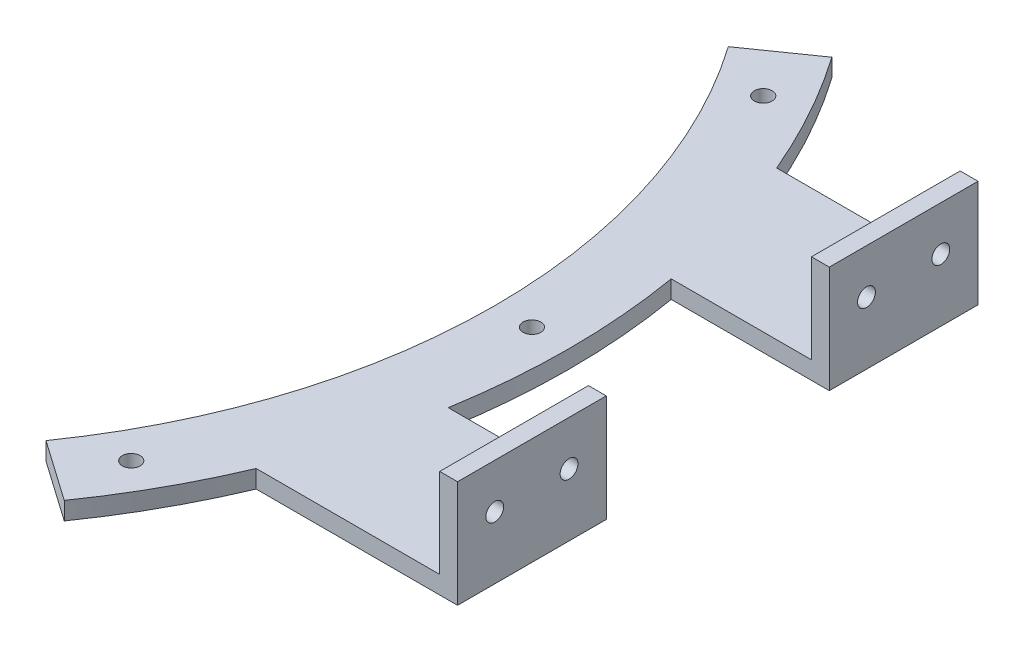
ISO-10303-21;
HEADER;
FILE_DESCRIPTION(('STEP AP214'),'2;1');
FILE_NAME('part.step','',(''),(''),'','','');
FILE_SCHEMA(('AUTOMOTIVE_DESIGN { 1 0 10303 214 1 1 1 1 }'));
ENDSEC;
DATA;
#1=APPLICATION_CONTEXT('core data for automotive mechanical design processes');
#2=APPLICATION_PROTOCOL_DEFINITION('international standard','automotive_design',2000,#1);
#3=PRODUCT_CONTEXT('',#1,'mechanical');
#4=PRODUCT('Part','Part','',(#3));
#5=PRODUCT_RELATED_PRODUCT_CATEGORY('part','',(#4));
#6=PRODUCT_DEFINITION_FORMATION('','',#4);
#7=PRODUCT_DEFINITION_CONTEXT('part definition',#1,'design');
#8=PRODUCT_DEFINITION('design','',#6,#7);
#9=PRODUCT_DEFINITION_SHAPE('','',#8);
#10=(LENGTH_UNIT() NAMED_UNIT(*) SI_UNIT(.MILLI.,.METRE.));
#11=(NAMED_UNIT(*) PLANE_ANGLE_UNIT() SI_UNIT($,.RADIAN.));
#12=(NAMED_UNIT(*) SI_UNIT($,.STERADIAN.) SOLID_ANGLE_UNIT());
#13=UNCERTAINTY_MEASURE_WITH_UNIT(LENGTH_MEASURE(1.E-05),#10,'distance_accuracy_value','');
#14=(GEOMETRIC_REPRESENTATION_CONTEXT(3) GLOBAL_UNCERTAINTY_ASSIGNED_CONTEXT((#13)) GLOBAL_UNIT_ASSIGNED_CONTEXT((#10,
#11,#12)) REPRESENTATION_CONTEXT('',''));
#15=CARTESIAN_POINT('',(0.,0.,0.));
#16=DIRECTION('',(0.,0.,1.));
#17=DIRECTION('',(1.,0.,0.));
#18=AXIS2_PLACEMENT_3D('',#15,#16,#17);
#19=CARTESIAN_POINT('',(0.,12.,0.));
#20=DIRECTION('',(0.,1.,0.));
#21=DIRECTION('',(0.,0.,1.));
#22=AXIS2_PLACEMENT_3D('',#19,#20,#21);
#23=PLANE('',#22);
#24=CARTESIAN_POINT('',(425.,12.,0.));
#25=DIRECTION('',(0.,1.,0.));
#26=DIRECTION('',(0.,0.,1.));
#27=AXIS2_PLACEMENT_3D('',#24,#25,#26);
#28=CIRCLE('',#27,5.99999999999999);
#29=CARTESIAN_POINT('',(425.,12.,5.99999999999999));
#30=VERTEX_POINT('',#29);
#31=EDGE_CURVE('E207',#30,#30,#28,.T.);
#32=ORIENTED_EDGE('',*,*,#31,.F.);
#33=EDGE_LOOP('',(#32));
#34=FACE_BOUND('',#33,.T.);
#35=CARTESIAN_POINT('',(368.060796608386,12.,212.5));
#36=DIRECTION('',(0.,1.,0.));
#37=DIRECTION('',(0.,0.,1.));
#38=AXIS2_PLACEMENT_3D('',#35,#36,#37);
#39=CIRCLE('',#38,5.99999999999999);
#40=CARTESIAN_POINT('',(368.060796608386,12.,218.5));
#41=VERTEX_POINT('',#40);
#42=EDGE_CURVE('E213',#41,#41,#39,.T.);
#43=ORIENTED_EDGE('',*,*,#42,.F.);
#44=EDGE_LOOP('',(#43));
#45=FACE_BOUND('',#44,.T.);
#46=CARTESIAN_POINT('',(368.060796608386,12.,-212.5));
#47=DIRECTION('',(0.,1.,0.));
#48=DIRECTION('',(0.,0.,1.));
#49=AXIS2_PLACEMENT_3D('',#46,#47,#48);
#50=CIRCLE('',#49,5.99999999999999);
#51=CARTESIAN_POINT('',(368.060796608386,12.,-206.5));
#52=VERTEX_POINT('',#51);
#53=EDGE_CURVE('E201',#52,#52,#50,.T.);
#54=ORIENTED_EDGE('',*,*,#53,.F.);
#55=EDGE_LOOP('',(#54));
#56=FACE_BOUND('',#55,.T.);
#57=DIRECTION('',(1.,0.,0.));
#58=VECTOR('',#57,1.);
#59=CARTESIAN_POINT('',(550.,12.,-74.9999999999999));
#60=LINE('',#59,#58);
#61=CARTESIAN_POINT('',(443.705983732471,12.,-74.9999999999999));
#62=VERTEX_POINT('',#61);
#63=CARTESIAN_POINT('',(538.,12.,-74.9999999999999));
#64=VERTEX_POINT('',#63);
#65=EDGE_CURVE('E50',#62,#64,#60,.T.);
#66=ORIENTED_EDGE('',*,*,#65,.T.);
#67=DIRECTION('',(0.,0.,1.));
#68=VECTOR('',#67,1.);
#69=CARTESIAN_POINT('',(538.,12.,-74.9999999999999));
#70=LINE('',#69,#68);
#71=CARTESIAN_POINT('',(538.,12.,-175.));
#72=VERTEX_POINT('',#71);
#73=EDGE_CURVE('E168',#72,#64,#70,.T.);
#74=ORIENTED_EDGE('',*,*,#73,.F.);
#75=DIRECTION('',(-1.,0.,0.));
#76=VECTOR('',#75,1.);
#77=CARTESIAN_POINT('',(550.,12.,-175.));
#78=LINE('',#77,#76);
#79=CARTESIAN_POINT('',(414.578098794425,12.,-175.));
#80=VERTEX_POINT('',#79);
#81=EDGE_CURVE('E219',#72,#80,#78,.T.);
#82=ORIENTED_EDGE('',*,*,#81,.T.);
#83=CARTESIAN_POINT('',(0.,12.,0.));
#84=DIRECTION('',(0.,1.,0.));
#85=DIRECTION('',(0.,0.,1.));
#86=AXIS2_PLACEMENT_3D('',#83,#84,#85);
#87=CIRCLE('',#86,450.);
#88=CARTESIAN_POINT('',(368.618419930047,12.,-258.10939635797));
#89=VERTEX_POINT('',#88);
#90=EDGE_CURVE('E222',#80,#89,#87,.T.);
#91=ORIENTED_EDGE('',*,*,#90,.T.);
#92=DIRECTION('',(-0.819152044288994,0.,0.573576436351044));
#93=VECTOR('',#92,1.);
#94=CARTESIAN_POINT('',(327.660817715597,12.,-229.430574540418));
#95=LINE('',#94,#93);
#96=CARTESIAN_POINT('',(327.660817715597,12.,-229.430574540418));
#97=VERTEX_POINT('',#96);
#98=EDGE_CURVE('E224',#89,#97,#95,.T.);
#99=ORIENTED_EDGE('',*,*,#98,.T.);
#100=CARTESIAN_POINT('',(0.,12.,0.));
#101=DIRECTION('',(0.,-1.,0.));
#102=DIRECTION('',(0.,0.,1.));
#103=AXIS2_PLACEMENT_3D('',#100,#101,#102);
#104=CIRCLE('',#103,400.);
#105=CARTESIAN_POINT('',(327.660817715597,12.,229.430574540418));
#106=VERTEX_POINT('',#105);
#107=EDGE_CURVE('E226',#97,#106,#104,.T.);
#108=ORIENTED_EDGE('',*,*,#107,.T.);
#109=DIRECTION('',(0.819152044288994,0.,0.573576436351044));
#110=VECTOR('',#109,1.);
#111=CARTESIAN_POINT('',(327.660817715597,12.,229.430574540418));
#112=LINE('',#111,#110);
#113=CARTESIAN_POINT('',(368.618419930047,12.,258.10939635797));
#114=VERTEX_POINT('',#113);
#115=EDGE_CURVE('E228',#106,#114,#112,.T.);
#116=ORIENTED_EDGE('',*,*,#115,.T.);
#117=CARTESIAN_POINT('',(0.,12.,0.));
#118=DIRECTION('',(0.,1.,0.));
#119=DIRECTION('',(0.,0.,1.));
#120=AXIS2_PLACEMENT_3D('',#117,#118,#119);
#121=CIRCLE('',#120,450.);
#122=CARTESIAN_POINT('',(414.578098794425,12.,175.));
#123=VERTEX_POINT('',#122);
#124=EDGE_CURVE('E230',#114,#123,#121,.T.);
#125=ORIENTED_EDGE('',*,*,#124,.T.);
#126=DIRECTION('',(1.,0.,0.));
#127=VECTOR('',#126,1.);
#128=CARTESIAN_POINT('',(550.,12.,175.));
#129=LINE('',#128,#127);
#130=CARTESIAN_POINT('',(538.,12.,175.));
#131=VERTEX_POINT('',#130);
#132=EDGE_CURVE('E232',#123,#131,#129,.T.);
#133=ORIENTED_EDGE('',*,*,#132,.T.);
#134=DIRECTION('',(0.,0.,1.));
#135=VECTOR('',#134,1.);
#136=CARTESIAN_POINT('',(538.,12.,175.));
#137=LINE('',#136,#135);
#138=CARTESIAN_POINT('',(538.,12.,75.));
#139=VERTEX_POINT('',#138);
#140=EDGE_CURVE('E57',#139,#131,#137,.T.);
#141=ORIENTED_EDGE('',*,*,#140,.F.);
#142=DIRECTION('',(-1.,0.,0.));
#143=VECTOR('',#142,1.);
#144=CARTESIAN_POINT('',(550.,12.,75.));
#145=LINE('',#144,#143);
#146=CARTESIAN_POINT('',(443.705983732471,12.,75.0000000000001));
#147=VERTEX_POINT('',#146);
#148=EDGE_CURVE('E234',#139,#147,#145,.T.);
#149=ORIENTED_EDGE('',*,*,#148,.T.);
#150=CARTESIAN_POINT('',(0.,12.,0.));
#151=DIRECTION('',(0.,1.,0.));
#152=DIRECTION('',(0.,0.,1.));
#153=AXIS2_PLACEMENT_3D('',#150,#151,#152);
#154=CIRCLE('',#153,450.);
#155=EDGE_CURVE('E236',#147,#62,#154,.T.);
#156=ORIENTED_EDGE('',*,*,#155,.T.);
#157=EDGE_LOOP('',(#66,#74,#82,#91,#99,#108,#116,#125,#133,#141,#149,#156));
#158=FACE_BOUND('',#157,.T.);
#159=ADVANCED_FACE('F35',(#34,#45,#56,#158),#23,.T.);
#160=CARTESIAN_POINT('',(0.,0.,0.));
#161=DIRECTION('',(0.,1.,0.));
#162=DIRECTION('',(0.,0.,1.));
#163=AXIS2_PLACEMENT_3D('',#160,#161,#162);
#164=PLANE('',#163);
#165=DIRECTION('',(1.,0.,0.));
#166=VECTOR('',#165,1.);
#167=CARTESIAN_POINT('',(550.,0.,-74.9999999999999));
#168=LINE('',#167,#166);
#169=CARTESIAN_POINT('',(443.705983732471,0.,-74.9999999999999));
#170=VERTEX_POINT('',#169);
#171=CARTESIAN_POINT('',(550.,0.,-74.9999999999999));
#172=VERTEX_POINT('',#171);
#173=EDGE_CURVE('E154',#170,#172,#168,.T.);
#174=ORIENTED_EDGE('',*,*,#173,.F.);
#175=CARTESIAN_POINT('',(0.,0.,0.));
#176=DIRECTION('',(0.,1.,0.));
#177=DIRECTION('',(0.,0.,1.));
#178=AXIS2_PLACEMENT_3D('',#175,#176,#177);
#179=CIRCLE('',#178,450.);
#180=CARTESIAN_POINT('',(443.705983732471,0.,75.0000000000001));
#181=VERTEX_POINT('',#180);
#182=EDGE_CURVE('E220',#181,#170,#179,.T.);
#183=ORIENTED_EDGE('',*,*,#182,.F.);
#184=DIRECTION('',(-1.,0.,0.));
#185=VECTOR('',#184,1.);
#186=CARTESIAN_POINT('',(550.,0.,75.));
#187=LINE('',#186,#185);
#188=CARTESIAN_POINT('',(550.,0.,75.));
#189=VERTEX_POINT('',#188);
#190=EDGE_CURVE('E258',#189,#181,#187,.T.);
#191=ORIENTED_EDGE('',*,*,#190,.F.);
#192=DIRECTION('',(0.,0.,-1.));
#193=VECTOR('',#192,1.);
#194=CARTESIAN_POINT('',(550.,0.,175.));
#195=LINE('',#194,#193);
#196=CARTESIAN_POINT('',(550.,0.,175.));
#197=VERTEX_POINT('',#196);
#198=EDGE_CURVE('E256',#197,#189,#195,.T.);
#199=ORIENTED_EDGE('',*,*,#198,.F.);
#200=DIRECTION('',(1.,0.,0.));
#201=VECTOR('',#200,1.);
#202=CARTESIAN_POINT('',(550.,0.,175.));
#203=LINE('',#202,#201);
#204=CARTESIAN_POINT('',(414.578098794425,0.,175.));
#205=VERTEX_POINT('',#204);
#206=EDGE_CURVE('E254',#205,#197,#203,.T.);
#207=ORIENTED_EDGE('',*,*,#206,.F.);
#208=CARTESIAN_POINT('',(0.,0.,0.));
#209=DIRECTION('',(0.,1.,0.));
#210=DIRECTION('',(0.,0.,1.));
#211=AXIS2_PLACEMENT_3D('',#208,#209,#210);
#212=CIRCLE('',#211,450.);
#213=CARTESIAN_POINT('',(368.618419930047,0.,258.10939635797));
#214=VERTEX_POINT('',#213);
#215=EDGE_CURVE('E252',#214,#205,#212,.T.);
#216=ORIENTED_EDGE('',*,*,#215,.F.);
#217=DIRECTION('',(0.819152044288994,0.,0.573576436351044));
#218=VECTOR('',#217,1.);
#219=CARTESIAN_POINT('',(327.660817715597,0.,229.430574540418));
#220=LINE('',#219,#218);
#221=CARTESIAN_POINT('',(327.660817715597,0.,229.430574540418));
#222=VERTEX_POINT('',#221);
#223=EDGE_CURVE('E250',#222,#214,#220,.T.);
#224=ORIENTED_EDGE('',*,*,#223,.F.);
#225=CARTESIAN_POINT('',(0.,0.,0.));
#226=DIRECTION('',(0.,-1.,0.));
#227=DIRECTION('',(0.,0.,1.));
#228=AXIS2_PLACEMENT_3D('',#225,#226,#227);
#229=CIRCLE('',#228,400.);
#230=CARTESIAN_POINT('',(327.660817715597,0.,-229.430574540418));
#231=VERTEX_POINT('',#230);
#232=EDGE_CURVE('E248',#231,#222,#229,.T.);
#233=ORIENTED_EDGE('',*,*,#232,.F.);
#234=DIRECTION('',(-0.819152044288994,0.,0.573576436351044));
#235=VECTOR('',#234,1.);
#236=CARTESIAN_POINT('',(327.660817715597,0.,-229.430574540418));
#237=LINE('',#236,#235);
#238=CARTESIAN_POINT('',(368.618419930047,0.,-258.10939635797));
#239=VERTEX_POINT('',#238);
#240=EDGE_CURVE('E246',#239,#231,#237,.T.);
#241=ORIENTED_EDGE('',*,*,#240,.F.);
#242=CARTESIAN_POINT('',(0.,0.,0.));
#243=DIRECTION('',(0.,1.,0.));
#244=DIRECTION('',(0.,0.,1.));
#245=AXIS2_PLACEMENT_3D('',#242,#243,#244);
#246=CIRCLE('',#245,450.);
#247=CARTESIAN_POINT('',(414.578098794425,0.,-175.));
#248=VERTEX_POINT('',#247);
#249=EDGE_CURVE('E244',#248,#239,#246,.T.);
#250=ORIENTED_EDGE('',*,*,#249,.F.);
#251=DIRECTION('',(-1.,0.,0.));
#252=VECTOR('',#251,1.);
#253=CARTESIAN_POINT('',(550.,0.,-175.));
#254=LINE('',#253,#252);
#255=CARTESIAN_POINT('',(550.,0.,-175.));
#256=VERTEX_POINT('',#255);
#257=EDGE_CURVE('E242',#256,#248,#254,.T.);
#258=ORIENTED_EDGE('',*,*,#257,.F.);
#259=DIRECTION('',(0.,0.,-1.));
#260=VECTOR('',#259,1.);
#261=CARTESIAN_POINT('',(550.,0.,-175.));
#262=LINE('',#261,#260);
#263=EDGE_CURVE('E240',#172,#256,#262,.T.);
#264=ORIENTED_EDGE('',*,*,#263,.F.);
#265=EDGE_LOOP('',(#174,#183,#191,#199,#207,#216,#224,#233,#241,#250,#258,#264));
#266=FACE_BOUND('',#265,.T.);
#267=CARTESIAN_POINT('',(368.060796608386,0.,212.5));
#268=DIRECTION('',(0.,1.,0.));
#269=DIRECTION('',(0.,0.,1.));
#270=AXIS2_PLACEMENT_3D('',#267,#268,#269);
#271=CIRCLE('',#270,5.99999999999999);
#272=CARTESIAN_POINT('',(368.060796608386,0.,218.5));
#273=VERTEX_POINT('',#272);
#274=EDGE_CURVE('E210',#273,#273,#271,.T.);
#275=ORIENTED_EDGE('',*,*,#274,.T.);
#276=EDGE_LOOP('',(#275));
#277=FACE_BOUND('',#276,.T.);
#278=CARTESIAN_POINT('',(425.,0.,0.));
#279=DIRECTION('',(0.,1.,0.));
#280=DIRECTION('',(0.,0.,1.));
#281=AXIS2_PLACEMENT_3D('',#278,#279,#280);
#282=CIRCLE('',#281,5.99999999999999);
#283=CARTESIAN_POINT('',(425.,0.,5.99999999999999));
#284=VERTEX_POINT('',#283);
#285=EDGE_CURVE('E204',#284,#284,#282,.T.);
#286=ORIENTED_EDGE('',*,*,#285,.T.);
#287=EDGE_LOOP('',(#286));
#288=FACE_BOUND('',#287,.T.);
#289=CARTESIAN_POINT('',(368.060796608386,0.,-212.5));
#290=DIRECTION('',(0.,1.,0.));
#291=DIRECTION('',(0.,0.,1.));
#292=AXIS2_PLACEMENT_3D('',#289,#290,#291);
#293=CIRCLE('',#292,5.99999999999999);
#294=CARTESIAN_POINT('',(368.060796608386,0.,-206.5));
#295=VERTEX_POINT('',#294);
#296=EDGE_CURVE('E200',#295,#295,#293,.T.);
#297=ORIENTED_EDGE('',*,*,#296,.T.);
#298=EDGE_LOOP('',(#297));
#299=FACE_BOUND('',#298,.T.);
#300=ADVANCED_FACE('F295',(#266,#277,#288,#299),#164,.F.);
#301=CARTESIAN_POINT('',(550.,12.,-74.9999999999999));
#302=DIRECTION('',(0.,0.,-1.));
#303=DIRECTION('',(-1.,0.,0.));
#304=AXIS2_PLACEMENT_3D('',#301,#302,#303);
#305=PLANE('',#304);
#306=ORIENTED_EDGE('',*,*,#173,.T.);
#307=DIRECTION('',(0.,-1.,0.));
#308=VECTOR('',#307,1.);
#309=CARTESIAN_POINT('',(550.,12.,-74.9999999999999));
#310=LINE('',#309,#308);
#311=CARTESIAN_POINT('',(550.,72.,-74.9999999999999));
#312=VERTEX_POINT('',#311);
#313=EDGE_CURVE('E11',#312,#172,#310,.T.);
#314=ORIENTED_EDGE('',*,*,#313,.F.);
#315=DIRECTION('',(1.,0.,0.));
#316=VECTOR('',#315,1.);
#317=CARTESIAN_POINT('',(550.,72.,-74.9999999999999));
#318=LINE('',#317,#316);
#319=CARTESIAN_POINT('',(538.,72.,-74.9999999999999));
#320=VERTEX_POINT('',#319);
#321=EDGE_CURVE('E151',#320,#312,#318,.T.);
#322=ORIENTED_EDGE('',*,*,#321,.F.);
#323=DIRECTION('',(0.,-1.,0.));
#324=VECTOR('',#323,1.);
#325=CARTESIAN_POINT('',(538.,72.,-74.9999999999999));
#326=LINE('',#325,#324);
#327=EDGE_CURVE('E177',#320,#64,#326,.T.);
#328=ORIENTED_EDGE('',*,*,#327,.T.);
#329=ORIENTED_EDGE('',*,*,#65,.F.);
#330=DIRECTION('',(0.,-1.,0.));
#331=VECTOR('',#330,1.);
#332=CARTESIAN_POINT('',(443.705983732471,12.,-74.9999999999999));
#333=LINE('',#332,#331);
#334=EDGE_CURVE('E238',#62,#170,#333,.T.);
#335=ORIENTED_EDGE('',*,*,#334,.T.);
#336=EDGE_LOOP('',(#306,#314,#322,#328,#329,#335));
#337=FACE_BOUND('',#336,.T.);
#338=ADVANCED_FACE('F37',(#337),#305,.F.);
#339=CARTESIAN_POINT('',(550.,12.,-175.));
#340=DIRECTION('',(-1.,0.,0.));
#341=DIRECTION('',(0.,0.,1.));
#342=AXIS2_PLACEMENT_3D('',#339,#340,#341);
#343=PLANE('',#342);
#344=CARTESIAN_POINT('',(550.,42.,-150.));
#345=DIRECTION('',(-1.,0.,0.));
#346=DIRECTION('',(0.,0.,1.));
#347=AXIS2_PLACEMENT_3D('',#344,#345,#346);
#348=CIRCLE('',#347,6.00000000000002);
#349=CARTESIAN_POINT('',(550.,42.,-144.));
#350=VERTEX_POINT('',#349);
#351=EDGE_CURVE('E170',#350,#350,#348,.T.);
#352=ORIENTED_EDGE('',*,*,#351,.T.);
#353=EDGE_LOOP('',(#352));
#354=FACE_BOUND('',#353,.T.);
#355=CARTESIAN_POINT('',(550.,42.,-99.9999999999999));
#356=DIRECTION('',(-1.,0.,0.));
#357=DIRECTION('',(0.,0.,1.));
#358=AXIS2_PLACEMENT_3D('',#355,#356,#357);
#359=CIRCLE('',#358,6.);
#360=CARTESIAN_POINT('',(550.,42.,-93.9999999999999));
#361=VERTEX_POINT('',#360);
#362=EDGE_CURVE('E407',#361,#361,#359,.T.);
#363=ORIENTED_EDGE('',*,*,#362,.T.);
#364=EDGE_LOOP('',(#363));
#365=FACE_BOUND('',#364,.T.);
#366=ORIENTED_EDGE('',*,*,#263,.T.);
#367=DIRECTION('',(0.,-1.,0.));
#368=VECTOR('',#367,1.);
#369=CARTESIAN_POINT('',(550.,12.,-175.));
#370=LINE('',#369,#368);
#371=CARTESIAN_POINT('',(550.,72.,-175.));
#372=VERTEX_POINT('',#371);
#373=EDGE_CURVE('E43',#372,#256,#370,.T.);
#374=ORIENTED_EDGE('',*,*,#373,.F.);
#375=DIRECTION('',(0.,0.,-1.));
#376=VECTOR('',#375,1.);
#377=CARTESIAN_POINT('',(550.,72.,-74.9999999999999));
#378=LINE('',#377,#376);
#379=EDGE_CURVE('E157',#312,#372,#378,.T.);
#380=ORIENTED_EDGE('',*,*,#379,.F.);
#381=ORIENTED_EDGE('',*,*,#313,.T.);
#382=EDGE_LOOP('',(#366,#374,#380,#381));
#383=FACE_BOUND('',#382,.T.);
#384=ADVANCED_FACE('F158',(#354,#365,#383),#343,.F.);
#385=CARTESIAN_POINT('',(550.,12.,-175.));
#386=DIRECTION('',(0.,0.,1.));
#387=DIRECTION('',(1.,0.,0.));
#388=AXIS2_PLACEMENT_3D('',#385,#386,#387);
#389=PLANE('',#388);
#390=ORIENTED_EDGE('',*,*,#257,.T.);
#391=DIRECTION('',(0.,-1.,0.));
#392=VECTOR('',#391,1.);
#393=CARTESIAN_POINT('',(414.578098794425,12.,-175.));
#394=LINE('',#393,#392);
#395=EDGE_CURVE('E286',#80,#248,#394,.T.);
#396=ORIENTED_EDGE('',*,*,#395,.F.);
#397=ORIENTED_EDGE('',*,*,#81,.F.);
#398=DIRECTION('',(0.,-1.,0.));
#399=VECTOR('',#398,1.);
#400=CARTESIAN_POINT('',(538.,72.,-175.));
#401=LINE('',#400,#399);
#402=CARTESIAN_POINT('',(538.,72.,-175.));
#403=VERTEX_POINT('',#402);
#404=EDGE_CURVE('E180',#403,#72,#401,.T.);
#405=ORIENTED_EDGE('',*,*,#404,.F.);
#406=DIRECTION('',(-1.,0.,0.));
#407=VECTOR('',#406,1.);
#408=CARTESIAN_POINT('',(550.,72.,-175.));
#409=LINE('',#408,#407);
#410=EDGE_CURVE('E162',#372,#403,#409,.T.);
#411=ORIENTED_EDGE('',*,*,#410,.F.);
#412=ORIENTED_EDGE('',*,*,#373,.T.);
#413=EDGE_LOOP('',(#390,#396,#397,#405,#411,#412));
#414=FACE_BOUND('',#413,.T.);
#415=ADVANCED_FACE('F290',(#414),#389,.F.);
#416=CARTESIAN_POINT('',(0.,12.,0.));
#417=DIRECTION('',(0.,-1.,0.));
#418=DIRECTION('',(0.,0.,-1.));
#419=AXIS2_PLACEMENT_3D('',#416,#417,#418);
#420=CYLINDRICAL_SURFACE('',#419,450.);
#421=ORIENTED_EDGE('',*,*,#249,.T.);
#422=DIRECTION('',(0.,-1.,0.));
#423=VECTOR('',#422,1.);
#424=CARTESIAN_POINT('',(368.618419930047,12.,-258.10939635797));
#425=LINE('',#424,#423);
#426=EDGE_CURVE('E283',#89,#239,#425,.T.);
#427=ORIENTED_EDGE('',*,*,#426,.F.);
#428=ORIENTED_EDGE('',*,*,#90,.F.);
#429=ORIENTED_EDGE('',*,*,#395,.T.);
#430=EDGE_LOOP('',(#421,#427,#428,#429));
#431=FACE_BOUND('',#430,.T.);
#432=ADVANCED_FACE('F301',(#431),#420,.T.);
#433=CARTESIAN_POINT('',(327.660817715597,12.,-229.430574540418));
#434=DIRECTION('',(0.573576436351044,0.,0.819152044288993));
#435=DIRECTION('',(0.819152044288994,0.,-0.573576436351044));
#436=AXIS2_PLACEMENT_3D('',#433,#434,#435);
#437=PLANE('',#436);
#438=ORIENTED_EDGE('',*,*,#240,.T.);
#439=DIRECTION('',(0.,-1.,0.));
#440=VECTOR('',#439,1.);
#441=CARTESIAN_POINT('',(327.660817715597,12.,-229.430574540418));
#442=LINE('',#441,#440);
#443=EDGE_CURVE('E280',#97,#231,#442,.T.);
#444=ORIENTED_EDGE('',*,*,#443,.F.);
#445=ORIENTED_EDGE('',*,*,#98,.F.);
#446=ORIENTED_EDGE('',*,*,#426,.T.);
#447=EDGE_LOOP('',(#438,#444,#445,#446));
#448=FACE_BOUND('',#447,.T.);
#449=ADVANCED_FACE('F305',(#448),#437,.F.);
#450=CARTESIAN_POINT('',(0.,12.,0.));
#451=DIRECTION('',(0.,-1.,0.));
#452=DIRECTION('',(0.,0.,-1.));
#453=AXIS2_PLACEMENT_3D('',#450,#451,#452);
#454=CYLINDRICAL_SURFACE('',#453,400.);
#455=ORIENTED_EDGE('',*,*,#232,.T.);
#456=DIRECTION('',(0.,-1.,0.));
#457=VECTOR('',#456,1.);
#458=CARTESIAN_POINT('',(327.660817715597,12.,229.430574540418));
#459=LINE('',#458,#457);
#460=EDGE_CURVE('E277',#106,#222,#459,.T.);
#461=ORIENTED_EDGE('',*,*,#460,.F.);
#462=ORIENTED_EDGE('',*,*,#107,.F.);
#463=ORIENTED_EDGE('',*,*,#443,.T.);
#464=EDGE_LOOP('',(#455,#461,#462,#463));
#465=FACE_BOUND('',#464,.T.);
#466=ADVANCED_FACE('F386',(#465),#454,.F.);
#467=CARTESIAN_POINT('',(327.660817715597,12.,229.430574540418));
#468=DIRECTION('',(0.573576436351044,0.,-0.819152044288993));
#469=DIRECTION('',(-0.819152044288994,0.,-0.573576436351044));
#470=AXIS2_PLACEMENT_3D('',#467,#468,#469);
#471=PLANE('',#470);
#472=ORIENTED_EDGE('',*,*,#223,.T.);
#473=DIRECTION('',(0.,-1.,0.));
#474=VECTOR('',#473,1.);
#475=CARTESIAN_POINT('',(368.618419930047,12.,258.10939635797));
#476=LINE('',#475,#474);
#477=EDGE_CURVE('E274',#114,#214,#476,.T.);
#478=ORIENTED_EDGE('',*,*,#477,.F.);
#479=ORIENTED_EDGE('',*,*,#115,.F.);
#480=ORIENTED_EDGE('',*,*,#460,.T.);
#481=EDGE_LOOP('',(#472,#478,#479,#480));
#482=FACE_BOUND('',#481,.T.);
#483=ADVANCED_FACE('F383',(#482),#471,.F.);
#484=CARTESIAN_POINT('',(0.,12.,0.));
#485=DIRECTION('',(0.,-1.,0.));
#486=DIRECTION('',(0.,0.,-1.));
#487=AXIS2_PLACEMENT_3D('',#484,#485,#486);
#488=CYLINDRICAL_SURFACE('',#487,450.);
#489=ORIENTED_EDGE('',*,*,#215,.T.);
#490=DIRECTION('',(0.,-1.,0.));
#491=VECTOR('',#490,1.);
#492=CARTESIAN_POINT('',(414.578098794425,12.,175.));
#493=LINE('',#492,#491);
#494=EDGE_CURVE('E271',#123,#205,#493,.T.);
#495=ORIENTED_EDGE('',*,*,#494,.F.);
#496=ORIENTED_EDGE('',*,*,#124,.F.);
#497=ORIENTED_EDGE('',*,*,#477,.T.);
#498=EDGE_LOOP('',(#489,#495,#496,#497));
#499=FACE_BOUND('',#498,.T.);
#500=ADVANCED_FACE('F339',(#499),#488,.T.);
#501=CARTESIAN_POINT('',(550.,12.,175.));
#502=DIRECTION('',(0.,0.,-1.));
#503=DIRECTION('',(-1.,0.,0.));
#504=AXIS2_PLACEMENT_3D('',#501,#502,#503);
#505=PLANE('',#504);
#506=ORIENTED_EDGE('',*,*,#206,.T.);
#507=DIRECTION('',(0.,-1.,0.));
#508=VECTOR('',#507,1.);
#509=CARTESIAN_POINT('',(550.,12.,175.));
#510=LINE('',#509,#508);
#511=CARTESIAN_POINT('',(550.,72.,175.));
#512=VERTEX_POINT('',#511);
#513=EDGE_CURVE('E268',#512,#197,#510,.T.);
#514=ORIENTED_EDGE('',*,*,#513,.F.);
#515=DIRECTION('',(1.,0.,0.));
#516=VECTOR('',#515,1.);
#517=CARTESIAN_POINT('',(550.,72.,175.));
#518=LINE('',#517,#516);
#519=CARTESIAN_POINT('',(538.,72.,175.));
#520=VERTEX_POINT('',#519);
#521=EDGE_CURVE('E183',#520,#512,#518,.T.);
#522=ORIENTED_EDGE('',*,*,#521,.F.);
#523=DIRECTION('',(0.,-1.,0.));
#524=VECTOR('',#523,1.);
#525=CARTESIAN_POINT('',(538.,72.,175.));
#526=LINE('',#525,#524);
#527=EDGE_CURVE('E193',#520,#131,#526,.T.);
#528=ORIENTED_EDGE('',*,*,#527,.T.);
#529=ORIENTED_EDGE('',*,*,#132,.F.);
#530=ORIENTED_EDGE('',*,*,#494,.T.);
#531=EDGE_LOOP('',(#506,#514,#522,#528,#529,#530));
#532=FACE_BOUND('',#531,.T.);
#533=ADVANCED_FACE('F332',(#532),#505,.F.);
#534=CARTESIAN_POINT('',(550.,12.,175.));
#535=DIRECTION('',(-1.,0.,0.));
#536=DIRECTION('',(0.,0.,1.));
#537=AXIS2_PLACEMENT_3D('',#534,#535,#536);
#538=PLANE('',#537);
#539=CARTESIAN_POINT('',(550.,42.,100.));
#540=DIRECTION('',(-1.,0.,0.));
#541=DIRECTION('',(0.,0.,1.));
#542=AXIS2_PLACEMENT_3D('',#539,#540,#541);
#543=CIRCLE('',#542,6.);
#544=CARTESIAN_POINT('',(550.,42.,106.));
#545=VERTEX_POINT('',#544);
#546=EDGE_CURVE('E415',#545,#545,#543,.T.);
#547=ORIENTED_EDGE('',*,*,#546,.T.);
#548=EDGE_LOOP('',(#547));
#549=FACE_BOUND('',#548,.T.);
#550=CARTESIAN_POINT('',(550.,42.,150.));
#551=DIRECTION('',(-1.,0.,0.));
#552=DIRECTION('',(0.,0.,1.));
#553=AXIS2_PLACEMENT_3D('',#550,#551,#552);
#554=CIRCLE('',#553,6.00000000000002);
#555=CARTESIAN_POINT('',(550.,42.,156.));
#556=VERTEX_POINT('',#555);
#557=EDGE_CURVE('E423',#556,#556,#554,.T.);
#558=ORIENTED_EDGE('',*,*,#557,.T.);
#559=EDGE_LOOP('',(#558));
#560=FACE_BOUND('',#559,.T.);
#561=ORIENTED_EDGE('',*,*,#198,.T.);
#562=DIRECTION('',(0.,-1.,0.));
#563=VECTOR('',#562,1.);
#564=CARTESIAN_POINT('',(550.,12.,75.));
#565=LINE('',#564,#563);
#566=CARTESIAN_POINT('',(550.,72.,75.));
#567=VERTEX_POINT('',#566);
#568=EDGE_CURVE('E265',#567,#189,#565,.T.);
#569=ORIENTED_EDGE('',*,*,#568,.F.);
#570=DIRECTION('',(0.,0.,-1.));
#571=VECTOR('',#570,1.);
#572=CARTESIAN_POINT('',(550.,72.,175.));
#573=LINE('',#572,#571);
#574=EDGE_CURVE('E186',#512,#567,#573,.T.);
#575=ORIENTED_EDGE('',*,*,#574,.F.);
#576=ORIENTED_EDGE('',*,*,#513,.T.);
#577=EDGE_LOOP('',(#561,#569,#575,#576));
#578=FACE_BOUND('',#577,.T.);
#579=ADVANCED_FACE('F325',(#549,#560,#578),#538,.F.);
#580=CARTESIAN_POINT('',(550.,12.,75.));
#581=DIRECTION('',(0.,0.,1.));
#582=DIRECTION('',(1.,0.,0.));
#583=AXIS2_PLACEMENT_3D('',#580,#581,#582);
#584=PLANE('',#583);
#585=ORIENTED_EDGE('',*,*,#190,.T.);
#586=DIRECTION('',(0.,-1.,0.));
#587=VECTOR('',#586,1.);
#588=CARTESIAN_POINT('',(443.705983732471,12.,75.0000000000001));
#589=LINE('',#588,#587);
#590=EDGE_CURVE('E262',#147,#181,#589,.T.);
#591=ORIENTED_EDGE('',*,*,#590,.F.);
#592=ORIENTED_EDGE('',*,*,#148,.F.);
#593=DIRECTION('',(0.,-1.,0.));
#594=VECTOR('',#593,1.);
#595=CARTESIAN_POINT('',(538.,72.,75.));
#596=LINE('',#595,#594);
#597=CARTESIAN_POINT('',(538.,72.,75.));
#598=VERTEX_POINT('',#597);
#599=EDGE_CURVE('E197',#598,#139,#596,.T.);
#600=ORIENTED_EDGE('',*,*,#599,.F.);
#601=DIRECTION('',(-1.,0.,0.));
#602=VECTOR('',#601,1.);
#603=CARTESIAN_POINT('',(550.,72.,75.));
#604=LINE('',#603,#602);
#605=EDGE_CURVE('E189',#567,#598,#604,.T.);
#606=ORIENTED_EDGE('',*,*,#605,.F.);
#607=ORIENTED_EDGE('',*,*,#568,.T.);
#608=EDGE_LOOP('',(#585,#591,#592,#600,#606,#607));
#609=FACE_BOUND('',#608,.T.);
#610=ADVANCED_FACE('F320',(#609),#584,.F.);
#611=CARTESIAN_POINT('',(0.,12.,0.));
#612=DIRECTION('',(0.,-1.,0.));
#613=DIRECTION('',(0.,0.,-1.));
#614=AXIS2_PLACEMENT_3D('',#611,#612,#613);
#615=CYLINDRICAL_SURFACE('',#614,450.);
#616=ORIENTED_EDGE('',*,*,#182,.T.);
#617=ORIENTED_EDGE('',*,*,#334,.F.);
#618=ORIENTED_EDGE('',*,*,#155,.F.);
#619=ORIENTED_EDGE('',*,*,#590,.T.);
#620=EDGE_LOOP('',(#616,#617,#618,#619));
#621=FACE_BOUND('',#620,.T.);
#622=ADVANCED_FACE('F317',(#621),#615,.T.);
#623=CARTESIAN_POINT('',(368.060796608386,12.,212.5));
#624=DIRECTION('',(0.,-1.,0.));
#625=DIRECTION('',(0.,0.,-1.));
#626=AXIS2_PLACEMENT_3D('',#623,#624,#625);
#627=CYLINDRICAL_SURFACE('',#626,5.99999999999999);
#628=ORIENTED_EDGE('',*,*,#42,.T.);
#629=EDGE_LOOP('',(#628));
#630=FACE_BOUND('',#629,.T.);
#631=ORIENTED_EDGE('',*,*,#274,.F.);
#632=EDGE_LOOP('',(#631));
#633=FACE_BOUND('',#632,.T.);
#634=ADVANCED_FACE('F370',(#630,#633),#627,.F.);
#635=CARTESIAN_POINT('',(425.,12.,0.));
#636=DIRECTION('',(0.,-1.,0.));
#637=DIRECTION('',(0.,0.,-1.));
#638=AXIS2_PLACEMENT_3D('',#635,#636,#637);
#639=CYLINDRICAL_SURFACE('',#638,5.99999999999999);
#640=ORIENTED_EDGE('',*,*,#31,.T.);
#641=EDGE_LOOP('',(#640));
#642=FACE_BOUND('',#641,.T.);
#643=ORIENTED_EDGE('',*,*,#285,.F.);
#644=EDGE_LOOP('',(#643));
#645=FACE_BOUND('',#644,.T.);
#646=ADVANCED_FACE('F355',(#642,#645),#639,.F.);
#647=CARTESIAN_POINT('',(368.060796608386,12.,-212.5));
#648=DIRECTION('',(0.,-1.,0.));
#649=DIRECTION('',(0.,0.,-1.));
#650=AXIS2_PLACEMENT_3D('',#647,#648,#649);
#651=CYLINDRICAL_SURFACE('',#650,5.99999999999999);
#652=ORIENTED_EDGE('',*,*,#53,.T.);
#653=EDGE_LOOP('',(#652));
#654=FACE_BOUND('',#653,.T.);
#655=ORIENTED_EDGE('',*,*,#296,.F.);
#656=EDGE_LOOP('',(#655));
#657=FACE_BOUND('',#656,.T.);
#658=ADVANCED_FACE('F345',(#654,#657),#651,.F.);
#659=CARTESIAN_POINT('',(538.,72.,175.));
#660=DIRECTION('',(1.,0.,0.));
#661=DIRECTION('',(0.,0.,-1.));
#662=AXIS2_PLACEMENT_3D('',#659,#660,#661);
#663=PLANE('',#662);
#664=CARTESIAN_POINT('',(538.,42.,100.));
#665=DIRECTION('',(-1.,0.,0.));
#666=DIRECTION('',(0.,0.,1.));
#667=AXIS2_PLACEMENT_3D('',#664,#665,#666);
#668=CIRCLE('',#667,6.);
#669=CARTESIAN_POINT('',(538.,42.,106.));
#670=VERTEX_POINT('',#669);
#671=EDGE_CURVE('E421',#670,#670,#668,.T.);
#672=ORIENTED_EDGE('',*,*,#671,.F.);
#673=EDGE_LOOP('',(#672));
#674=FACE_BOUND('',#673,.T.);
#675=CARTESIAN_POINT('',(538.,42.,150.));
#676=DIRECTION('',(-1.,0.,0.));
#677=DIRECTION('',(0.,0.,1.));
#678=AXIS2_PLACEMENT_3D('',#675,#676,#677);
#679=CIRCLE('',#678,6.00000000000002);
#680=CARTESIAN_POINT('',(538.,42.,156.));
#681=VERTEX_POINT('',#680);
#682=EDGE_CURVE('E173',#681,#681,#679,.T.);
#683=ORIENTED_EDGE('',*,*,#682,.F.);
#684=EDGE_LOOP('',(#683));
#685=FACE_BOUND('',#684,.T.);
#686=ORIENTED_EDGE('',*,*,#140,.T.);
#687=ORIENTED_EDGE('',*,*,#527,.F.);
#688=DIRECTION('',(0.,0.,1.));
#689=VECTOR('',#688,1.);
#690=CARTESIAN_POINT('',(538.,72.,175.));
#691=LINE('',#690,#689);
#692=EDGE_CURVE('E191',#598,#520,#691,.T.);
#693=ORIENTED_EDGE('',*,*,#692,.F.);
#694=ORIENTED_EDGE('',*,*,#599,.T.);
#695=EDGE_LOOP('',(#686,#687,#693,#694));
#696=FACE_BOUND('',#695,.T.);
#697=ADVANCED_FACE('F343',(#674,#685,#696),#663,.F.);
#698=CARTESIAN_POINT('',(0.,72.,0.));
#699=DIRECTION('',(0.,-1.,0.));
#700=DIRECTION('',(0.,0.,-1.));
#701=AXIS2_PLACEMENT_3D('',#698,#699,#700);
#702=PLANE('',#701);
#703=ORIENTED_EDGE('',*,*,#521,.T.);
#704=ORIENTED_EDGE('',*,*,#574,.T.);
#705=ORIENTED_EDGE('',*,*,#605,.T.);
#706=ORIENTED_EDGE('',*,*,#692,.T.);
#707=EDGE_LOOP('',(#703,#704,#705,#706));
#708=FACE_BOUND('',#707,.T.);
#709=ADVANCED_FACE('F327',(#708),#702,.F.);
#710=CARTESIAN_POINT('',(538.,72.,-74.9999999999999));
#711=DIRECTION('',(1.,0.,0.));
#712=DIRECTION('',(0.,0.,-1.));
#713=AXIS2_PLACEMENT_3D('',#710,#711,#712);
#714=PLANE('',#713);
#715=CARTESIAN_POINT('',(538.,42.,-150.));
#716=DIRECTION('',(-1.,0.,0.));
#717=DIRECTION('',(0.,0.,1.));
#718=AXIS2_PLACEMENT_3D('',#715,#716,#717);
#719=CIRCLE('',#718,6.00000000000002);
#720=CARTESIAN_POINT('',(538.,42.,-144.));
#721=VERTEX_POINT('',#720);
#722=EDGE_CURVE('E409',#721,#721,#719,.T.);
#723=ORIENTED_EDGE('',*,*,#722,.F.);
#724=EDGE_LOOP('',(#723));
#725=FACE_BOUND('',#724,.T.);
#726=CARTESIAN_POINT('',(538.,42.,-99.9999999999999));
#727=DIRECTION('',(-1.,0.,0.));
#728=DIRECTION('',(0.,0.,1.));
#729=AXIS2_PLACEMENT_3D('',#726,#727,#728);
#730=CIRCLE('',#729,6.);
#731=CARTESIAN_POINT('',(538.,42.,-93.9999999999999));
#732=VERTEX_POINT('',#731);
#733=EDGE_CURVE('E410',#732,#732,#730,.T.);
#734=ORIENTED_EDGE('',*,*,#733,.F.);
#735=EDGE_LOOP('',(#734));
#736=FACE_BOUND('',#735,.T.);
#737=ORIENTED_EDGE('',*,*,#73,.T.);
#738=ORIENTED_EDGE('',*,*,#327,.F.);
#739=DIRECTION('',(0.,0.,1.));
#740=VECTOR('',#739,1.);
#741=CARTESIAN_POINT('',(538.,72.,-74.9999999999999));
#742=LINE('',#741,#740);
#743=EDGE_CURVE('E166',#403,#320,#742,.T.);
#744=ORIENTED_EDGE('',*,*,#743,.F.);
#745=ORIENTED_EDGE('',*,*,#404,.T.);
#746=EDGE_LOOP('',(#737,#738,#744,#745));
#747=FACE_BOUND('',#746,.T.);
#748=ADVANCED_FACE('F310',(#725,#736,#747),#714,.F.);
#749=CARTESIAN_POINT('',(0.,72.,0.));
#750=DIRECTION('',(0.,-1.,0.));
#751=DIRECTION('',(0.,0.,-1.));
#752=AXIS2_PLACEMENT_3D('',#749,#750,#751);
#753=PLANE('',#752);
#754=ORIENTED_EDGE('',*,*,#321,.T.);
#755=ORIENTED_EDGE('',*,*,#379,.T.);
#756=ORIENTED_EDGE('',*,*,#410,.T.);
#757=ORIENTED_EDGE('',*,*,#743,.T.);
#758=EDGE_LOOP('',(#754,#755,#756,#757));
#759=FACE_BOUND('',#758,.T.);
#760=ADVANCED_FACE('F164',(#759),#753,.F.);
#761=CARTESIAN_POINT('',(550.,42.,-99.9999999999999));
#762=DIRECTION('',(-1.,0.,0.));
#763=DIRECTION('',(0.,0.,1.));
#764=AXIS2_PLACEMENT_3D('',#761,#762,#763);
#765=CYLINDRICAL_SURFACE('',#764,6.);
#766=ORIENTED_EDGE('',*,*,#362,.F.);
#767=EDGE_LOOP('',(#766));
#768=FACE_BOUND('',#767,.T.);
#769=ORIENTED_EDGE('',*,*,#733,.T.);
#770=EDGE_LOOP('',(#769));
#771=FACE_BOUND('',#770,.T.);
#772=ADVANCED_FACE('F442',(#768,#771),#765,.F.);
#773=CARTESIAN_POINT('',(550.,42.,-150.));
#774=DIRECTION('',(-1.,0.,0.));
#775=DIRECTION('',(0.,0.,1.));
#776=AXIS2_PLACEMENT_3D('',#773,#774,#775);
#777=CYLINDRICAL_SURFACE('',#776,6.00000000000002);
#778=ORIENTED_EDGE('',*,*,#351,.F.);
#779=EDGE_LOOP('',(#778));
#780=FACE_BOUND('',#779,.T.);
#781=ORIENTED_EDGE('',*,*,#722,.T.);
#782=EDGE_LOOP('',(#781));
#783=FACE_BOUND('',#782,.T.);
#784=ADVANCED_FACE('F433',(#780,#783),#777,.F.);
#785=CARTESIAN_POINT('',(550.,42.,150.));
#786=DIRECTION('',(-1.,0.,0.));
#787=DIRECTION('',(0.,0.,1.));
#788=AXIS2_PLACEMENT_3D('',#785,#786,#787);
#789=CYLINDRICAL_SURFACE('',#788,6.00000000000002);
#790=ORIENTED_EDGE('',*,*,#557,.F.);
#791=EDGE_LOOP('',(#790));
#792=FACE_BOUND('',#791,.T.);
#793=ORIENTED_EDGE('',*,*,#682,.T.);
#794=EDGE_LOOP('',(#793));
#795=FACE_BOUND('',#794,.T.);
#796=ADVANCED_FACE('F430',(#792,#795),#789,.F.);
#797=CARTESIAN_POINT('',(550.,42.,100.));
#798=DIRECTION('',(-1.,0.,0.));
#799=DIRECTION('',(0.,0.,1.));
#800=AXIS2_PLACEMENT_3D('',#797,#798,#799);
#801=CYLINDRICAL_SURFACE('',#800,6.);
#802=ORIENTED_EDGE('',*,*,#546,.F.);
#803=EDGE_LOOP('',(#802));
#804=FACE_BOUND('',#803,.T.);
#805=ORIENTED_EDGE('',*,*,#671,.T.);
#806=EDGE_LOOP('',(#805));
#807=FACE_BOUND('',#806,.T.);
#808=ADVANCED_FACE('F432',(#804,#807),#801,.F.);
#809=CLOSED_SHELL('',(#159,#300,#338,#384,#415,#432,#449,#466,#483,#500,#533,#579,#610,#622,
#634,#646,#658,#697,#709,#748,#760,#772,#784,#796,#808));
#810=MANIFOLD_SOLID_BREP('B2',#809);
#811=ADVANCED_BREP_SHAPE_REPRESENTATION('',(#18,#810),#14);
#812=SHAPE_DEFINITION_REPRESENTATION(#9,#811);
ENDSEC;
END-ISO-10303-21;
